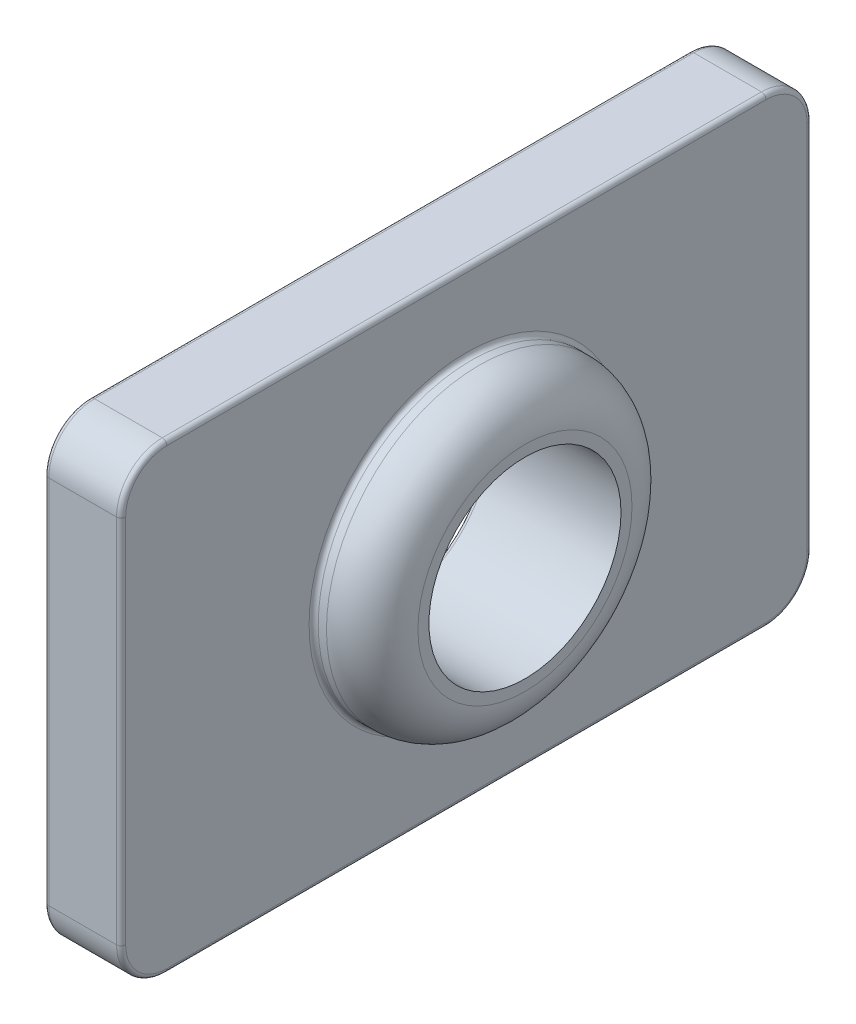
ISO-10303-21;
HEADER;
FILE_DESCRIPTION(('STEP AP214'),'2;1');
FILE_NAME('part.step','',(''),(''),'','','');
FILE_SCHEMA(('AUTOMOTIVE_DESIGN { 1 0 10303 214 1 1 1 1 }'));
ENDSEC;
DATA;
#1=APPLICATION_CONTEXT('core data for automotive mechanical design processes');
#2=APPLICATION_PROTOCOL_DEFINITION('international standard','automotive_design',2000,#1);
#3=PRODUCT_CONTEXT('',#1,'mechanical');
#4=PRODUCT('Part','Part','',(#3));
#5=PRODUCT_RELATED_PRODUCT_CATEGORY('part','',(#4));
#6=PRODUCT_DEFINITION_FORMATION('','',#4);
#7=PRODUCT_DEFINITION_CONTEXT('part definition',#1,'design');
#8=PRODUCT_DEFINITION('design','',#6,#7);
#9=PRODUCT_DEFINITION_SHAPE('','',#8);
#10=(LENGTH_UNIT() NAMED_UNIT(*) SI_UNIT(.MILLI.,.METRE.));
#11=(NAMED_UNIT(*) PLANE_ANGLE_UNIT() SI_UNIT($,.RADIAN.));
#12=(NAMED_UNIT(*) SI_UNIT($,.STERADIAN.) SOLID_ANGLE_UNIT());
#13=UNCERTAINTY_MEASURE_WITH_UNIT(LENGTH_MEASURE(1.E-05),#10,'distance_accuracy_value','');
#14=(GEOMETRIC_REPRESENTATION_CONTEXT(3) GLOBAL_UNCERTAINTY_ASSIGNED_CONTEXT((#13)) GLOBAL_UNIT_ASSIGNED_CONTEXT((#10,
#11,#12)) REPRESENTATION_CONTEXT('',''));
#15=CARTESIAN_POINT('',(0.,0.,0.));
#16=DIRECTION('',(0.,0.,1.));
#17=DIRECTION('',(1.,0.,0.));
#18=AXIS2_PLACEMENT_3D('',#15,#16,#17);
#19=CARTESIAN_POINT('',(1.68,-5.05,7.55));
#20=DIRECTION('',(0.,0.,-1.));
#21=DIRECTION('',(-1.,0.,0.));
#22=AXIS2_PLACEMENT_3D('',#19,#20,#21);
#23=PLANE('',#22);
#24=DIRECTION('',(-1.,0.,0.));
#25=VECTOR('',#24,1.);
#26=CARTESIAN_POINT('',(1.68,4.05,7.55));
#27=LINE('',#26,#25);
#28=CARTESIAN_POINT('',(1.58,4.05,7.55));
#29=VERTEX_POINT('',#28);
#30=CARTESIAN_POINT('',(0.1,4.05,7.55));
#31=VERTEX_POINT('',#30);
#32=EDGE_CURVE('E297',#29,#31,#27,.T.);
#33=ORIENTED_EDGE('',*,*,#32,.T.);
#34=DIRECTION('',(0.,-1.,0.));
#35=VECTOR('',#34,1.);
#36=CARTESIAN_POINT('',(0.1,-5.05,7.55));
#37=LINE('',#36,#35);
#38=CARTESIAN_POINT('',(0.1,-4.05,7.55));
#39=VERTEX_POINT('',#38);
#40=EDGE_CURVE('E203',#31,#39,#37,.T.);
#41=ORIENTED_EDGE('',*,*,#40,.T.);
#42=DIRECTION('',(-1.,0.,0.));
#43=VECTOR('',#42,1.);
#44=CARTESIAN_POINT('',(1.68,-4.05,7.55));
#45=LINE('',#44,#43);
#46=CARTESIAN_POINT('',(1.58,-4.05,7.55));
#47=VERTEX_POINT('',#46);
#48=EDGE_CURVE('E306',#39,#47,#45,.F.);
#49=ORIENTED_EDGE('',*,*,#48,.T.);
#50=DIRECTION('',(0.,-1.,0.));
#51=VECTOR('',#50,1.);
#52=CARTESIAN_POINT('',(1.58,4.05,7.55));
#53=LINE('',#52,#51);
#54=EDGE_CURVE('E201',#47,#29,#53,.F.);
#55=ORIENTED_EDGE('',*,*,#54,.T.);
#56=EDGE_LOOP('',(#33,#41,#49,#55));
#57=FACE_BOUND('',#56,.T.);
#58=ADVANCED_FACE('F34',(#57),#23,.F.);
#59=CARTESIAN_POINT('',(1.68,-5.05,-7.55));
#60=DIRECTION('',(0.,1.,0.));
#61=DIRECTION('',(0.,0.,1.));
#62=AXIS2_PLACEMENT_3D('',#59,#60,#61);
#63=PLANE('',#62);
#64=DIRECTION('',(-1.,0.,0.));
#65=VECTOR('',#64,1.);
#66=CARTESIAN_POINT('',(1.68,-5.05,6.55));
#67=LINE('',#66,#65);
#68=CARTESIAN_POINT('',(1.58,-5.05,6.55));
#69=VERTEX_POINT('',#68);
#70=CARTESIAN_POINT('',(0.1,-5.05,6.55));
#71=VERTEX_POINT('',#70);
#72=EDGE_CURVE('E294',#69,#71,#67,.T.);
#73=ORIENTED_EDGE('',*,*,#72,.T.);
#74=DIRECTION('',(0.,0.,-1.));
#75=VECTOR('',#74,1.);
#76=CARTESIAN_POINT('',(0.1,-5.05,-7.55));
#77=LINE('',#76,#75);
#78=CARTESIAN_POINT('',(0.1,-5.05,-6.55));
#79=VERTEX_POINT('',#78);
#80=EDGE_CURVE('E211',#71,#79,#77,.T.);
#81=ORIENTED_EDGE('',*,*,#80,.T.);
#82=DIRECTION('',(-1.,0.,0.));
#83=VECTOR('',#82,1.);
#84=CARTESIAN_POINT('',(1.68,-5.05,-6.55));
#85=LINE('',#84,#83);
#86=CARTESIAN_POINT('',(1.58,-5.05,-6.55));
#87=VERTEX_POINT('',#86);
#88=EDGE_CURVE('E287',#79,#87,#85,.F.);
#89=ORIENTED_EDGE('',*,*,#88,.T.);
#90=DIRECTION('',(0.,0.,-1.));
#91=VECTOR('',#90,1.);
#92=CARTESIAN_POINT('',(1.58,-5.05,6.55));
#93=LINE('',#92,#91);
#94=EDGE_CURVE('E209',#87,#69,#93,.F.);
#95=ORIENTED_EDGE('',*,*,#94,.T.);
#96=EDGE_LOOP('',(#73,#81,#89,#95));
#97=FACE_BOUND('',#96,.T.);
#98=ADVANCED_FACE('F292',(#97),#63,.F.);
#99=CARTESIAN_POINT('',(1.68,-5.05,-7.55));
#100=DIRECTION('',(0.,0.,1.));
#101=DIRECTION('',(1.,0.,0.));
#102=AXIS2_PLACEMENT_3D('',#99,#100,#101);
#103=PLANE('',#102);
#104=DIRECTION('',(-1.,0.,0.));
#105=VECTOR('',#104,1.);
#106=CARTESIAN_POINT('',(1.68,-4.05,-7.55));
#107=LINE('',#106,#105);
#108=CARTESIAN_POINT('',(1.58,-4.05,-7.55));
#109=VERTEX_POINT('',#108);
#110=CARTESIAN_POINT('',(0.1,-4.05,-7.55));
#111=VERTEX_POINT('',#110);
#112=EDGE_CURVE('E289',#109,#111,#107,.T.);
#113=ORIENTED_EDGE('',*,*,#112,.T.);
#114=DIRECTION('',(0.,1.,0.));
#115=VECTOR('',#114,1.);
#116=CARTESIAN_POINT('',(0.1,-5.05,-7.55));
#117=LINE('',#116,#115);
#118=CARTESIAN_POINT('',(0.1,4.05,-7.55));
#119=VERTEX_POINT('',#118);
#120=EDGE_CURVE('E186',#111,#119,#117,.T.);
#121=ORIENTED_EDGE('',*,*,#120,.T.);
#122=DIRECTION('',(-1.,0.,0.));
#123=VECTOR('',#122,1.);
#124=CARTESIAN_POINT('',(1.68,4.05,-7.55));
#125=LINE('',#124,#123);
#126=CARTESIAN_POINT('',(1.58,4.05,-7.55));
#127=VERTEX_POINT('',#126);
#128=EDGE_CURVE('E309',#119,#127,#125,.F.);
#129=ORIENTED_EDGE('',*,*,#128,.T.);
#130=DIRECTION('',(0.,1.,0.));
#131=VECTOR('',#130,1.);
#132=CARTESIAN_POINT('',(1.58,-4.05,-7.55));
#133=LINE('',#132,#131);
#134=EDGE_CURVE('E184',#127,#109,#133,.F.);
#135=ORIENTED_EDGE('',*,*,#134,.T.);
#136=EDGE_LOOP('',(#113,#121,#129,#135));
#137=FACE_BOUND('',#136,.T.);
#138=ADVANCED_FACE('F339',(#137),#103,.F.);
#139=CARTESIAN_POINT('',(1.68,5.05,-7.55));
#140=DIRECTION('',(0.,-1.,0.));
#141=DIRECTION('',(0.,0.,-1.));
#142=AXIS2_PLACEMENT_3D('',#139,#140,#141);
#143=PLANE('',#142);
#144=DIRECTION('',(-1.,0.,0.));
#145=VECTOR('',#144,1.);
#146=CARTESIAN_POINT('',(1.68,5.05,-6.55));
#147=LINE('',#146,#145);
#148=CARTESIAN_POINT('',(1.58,5.05,-6.55));
#149=VERTEX_POINT('',#148);
#150=CARTESIAN_POINT('',(0.1,5.05,-6.55));
#151=VERTEX_POINT('',#150);
#152=EDGE_CURVE('E316',#149,#151,#147,.T.);
#153=ORIENTED_EDGE('',*,*,#152,.T.);
#154=DIRECTION('',(0.,0.,1.));
#155=VECTOR('',#154,1.);
#156=CARTESIAN_POINT('',(0.1,5.05,-7.55));
#157=LINE('',#156,#155);
#158=CARTESIAN_POINT('',(0.1,5.05,6.55));
#159=VERTEX_POINT('',#158);
#160=EDGE_CURVE('E194',#151,#159,#157,.T.);
#161=ORIENTED_EDGE('',*,*,#160,.T.);
#162=DIRECTION('',(-1.,0.,0.));
#163=VECTOR('',#162,1.);
#164=CARTESIAN_POINT('',(1.68,5.05,6.55));
#165=LINE('',#164,#163);
#166=CARTESIAN_POINT('',(1.58,5.05,6.55));
#167=VERTEX_POINT('',#166);
#168=EDGE_CURVE('E313',#159,#167,#165,.F.);
#169=ORIENTED_EDGE('',*,*,#168,.T.);
#170=DIRECTION('',(0.,0.,1.));
#171=VECTOR('',#170,1.);
#172=CARTESIAN_POINT('',(1.58,5.05,-6.55));
#173=LINE('',#172,#171);
#174=EDGE_CURVE('E192',#167,#149,#173,.F.);
#175=ORIENTED_EDGE('',*,*,#174,.T.);
#176=EDGE_LOOP('',(#153,#161,#169,#175));
#177=FACE_BOUND('',#176,.T.);
#178=ADVANCED_FACE('F383',(#177),#143,.F.);
#179=CARTESIAN_POINT('',(1.68,0.,0.));
#180=DIRECTION('',(1.,0.,0.));
#181=DIRECTION('',(0.,0.,-1.));
#182=AXIS2_PLACEMENT_3D('',#179,#180,#181);
#183=PLANE('',#182);
#184=DIRECTION('',(0.,0.,1.));
#185=VECTOR('',#184,1.);
#186=CARTESIAN_POINT('',(1.68,4.95,6.55));
#187=LINE('',#186,#185);
#188=CARTESIAN_POINT('',(1.68,4.95,-6.55));
#189=VERTEX_POINT('',#188);
#190=CARTESIAN_POINT('',(1.68,4.95,6.55));
#191=VERTEX_POINT('',#190);
#192=EDGE_CURVE('E51',#189,#191,#187,.T.);
#193=ORIENTED_EDGE('',*,*,#192,.T.);
#194=CARTESIAN_POINT('',(1.68,4.05,6.55));
#195=DIRECTION('',(1.,0.,0.));
#196=DIRECTION('',(0.,0.,-1.));
#197=AXIS2_PLACEMENT_3D('',#194,#195,#196);
#198=CIRCLE('',#197,0.9);
#199=CARTESIAN_POINT('',(1.68,4.05,7.45));
#200=VERTEX_POINT('',#199);
#201=EDGE_CURVE('E43',#191,#200,#198,.T.);
#202=ORIENTED_EDGE('',*,*,#201,.T.);
#203=DIRECTION('',(0.,-1.,0.));
#204=VECTOR('',#203,1.);
#205=CARTESIAN_POINT('',(1.68,-4.05,7.45));
#206=LINE('',#205,#204);
#207=CARTESIAN_POINT('',(1.68,-4.05,7.45));
#208=VERTEX_POINT('',#207);
#209=EDGE_CURVE('E219',#200,#208,#206,.T.);
#210=ORIENTED_EDGE('',*,*,#209,.T.);
#211=CARTESIAN_POINT('',(1.68,-4.05,6.55));
#212=DIRECTION('',(1.,0.,0.));
#213=DIRECTION('',(0.,0.,-1.));
#214=AXIS2_PLACEMENT_3D('',#211,#212,#213);
#215=CIRCLE('',#214,0.9);
#216=CARTESIAN_POINT('',(1.68,-4.95,6.55));
#217=VERTEX_POINT('',#216);
#218=EDGE_CURVE('E221',#208,#217,#215,.T.);
#219=ORIENTED_EDGE('',*,*,#218,.T.);
#220=DIRECTION('',(0.,0.,-1.));
#221=VECTOR('',#220,1.);
#222=CARTESIAN_POINT('',(1.68,-4.95,-6.55));
#223=LINE('',#222,#221);
#224=CARTESIAN_POINT('',(1.68,-4.95,-6.55));
#225=VERTEX_POINT('',#224);
#226=EDGE_CURVE('E223',#217,#225,#223,.T.);
#227=ORIENTED_EDGE('',*,*,#226,.T.);
#228=CARTESIAN_POINT('',(1.68,-4.05,-6.55));
#229=DIRECTION('',(1.,0.,0.));
#230=DIRECTION('',(0.,0.,-1.));
#231=AXIS2_PLACEMENT_3D('',#228,#229,#230);
#232=CIRCLE('',#231,0.9);
#233=CARTESIAN_POINT('',(1.68,-4.05,-7.45));
#234=VERTEX_POINT('',#233);
#235=EDGE_CURVE('E225',#225,#234,#232,.T.);
#236=ORIENTED_EDGE('',*,*,#235,.T.);
#237=DIRECTION('',(0.,1.,0.));
#238=VECTOR('',#237,1.);
#239=CARTESIAN_POINT('',(1.68,4.05,-7.45));
#240=LINE('',#239,#238);
#241=CARTESIAN_POINT('',(1.68,4.05,-7.45));
#242=VERTEX_POINT('',#241);
#243=EDGE_CURVE('E227',#234,#242,#240,.T.);
#244=ORIENTED_EDGE('',*,*,#243,.T.);
#245=CARTESIAN_POINT('',(1.68,4.05,-6.55));
#246=DIRECTION('',(1.,0.,0.));
#247=DIRECTION('',(0.,0.,-1.));
#248=AXIS2_PLACEMENT_3D('',#245,#246,#247);
#249=CIRCLE('',#248,0.9);
#250=EDGE_CURVE('E56',#242,#189,#249,.T.);
#251=ORIENTED_EDGE('',*,*,#250,.T.);
#252=EDGE_LOOP('',(#193,#202,#210,#219,#227,#236,#244,#251));
#253=FACE_BOUND('',#252,.T.);
#254=CARTESIAN_POINT('',(1.68,0.,0.));
#255=DIRECTION('',(1.,0.,0.));
#256=DIRECTION('',(0.,0.,-1.));
#257=AXIS2_PLACEMENT_3D('',#254,#255,#256);
#258=CIRCLE('',#257,3.44);
#259=CARTESIAN_POINT('',(1.68,0.,-3.44));
#260=VERTEX_POINT('',#259);
#261=EDGE_CURVE('E216',#260,#260,#258,.F.);
#262=ORIENTED_EDGE('',*,*,#261,.T.);
#263=EDGE_LOOP('',(#262));
#264=FACE_BOUND('',#263,.T.);
#265=ADVANCED_FACE('F355',(#253,#264),#183,.T.);
#266=CARTESIAN_POINT('',(0.,0.,0.));
#267=DIRECTION('',(1.,0.,0.));
#268=DIRECTION('',(0.,0.,-1.));
#269=AXIS2_PLACEMENT_3D('',#266,#267,#268);
#270=PLANE('',#269);
#271=DIRECTION('',(0.,1.,0.));
#272=VECTOR('',#271,1.);
#273=CARTESIAN_POINT('',(0.,0.,-7.45));
#274=LINE('',#273,#272);
#275=CARTESIAN_POINT('',(0.,4.05,-7.45));
#276=VERTEX_POINT('',#275);
#277=CARTESIAN_POINT('',(0.,-4.05,-7.45));
#278=VERTEX_POINT('',#277);
#279=EDGE_CURVE('E174',#276,#278,#274,.F.);
#280=ORIENTED_EDGE('',*,*,#279,.T.);
#281=CARTESIAN_POINT('',(0.,-4.05,-6.55));
#282=DIRECTION('',(1.,0.,0.));
#283=DIRECTION('',(0.,0.,-1.));
#284=AXIS2_PLACEMENT_3D('',#281,#282,#283);
#285=CIRCLE('',#284,0.9);
#286=CARTESIAN_POINT('',(0.,-4.95,-6.55));
#287=VERTEX_POINT('',#286);
#288=EDGE_CURVE('E154',#278,#287,#285,.F.);
#289=ORIENTED_EDGE('',*,*,#288,.T.);
#290=DIRECTION('',(0.,0.,-1.));
#291=VECTOR('',#290,1.);
#292=CARTESIAN_POINT('',(0.,-4.95,0.));
#293=LINE('',#292,#291);
#294=CARTESIAN_POINT('',(0.,-4.95,6.55));
#295=VERTEX_POINT('',#294);
#296=EDGE_CURVE('E162',#287,#295,#293,.F.);
#297=ORIENTED_EDGE('',*,*,#296,.T.);
#298=CARTESIAN_POINT('',(0.,-4.05,6.55));
#299=DIRECTION('',(1.,0.,0.));
#300=DIRECTION('',(0.,0.,-1.));
#301=AXIS2_PLACEMENT_3D('',#298,#299,#300);
#302=CIRCLE('',#301,0.9);
#303=CARTESIAN_POINT('',(0.,-4.05,7.45));
#304=VERTEX_POINT('',#303);
#305=EDGE_CURVE('E168',#295,#304,#302,.F.);
#306=ORIENTED_EDGE('',*,*,#305,.T.);
#307=DIRECTION('',(0.,-1.,0.));
#308=VECTOR('',#307,1.);
#309=CARTESIAN_POINT('',(0.,0.,7.45));
#310=LINE('',#309,#308);
#311=CARTESIAN_POINT('',(0.,4.05,7.45));
#312=VERTEX_POINT('',#311);
#313=EDGE_CURVE('E322',#304,#312,#310,.F.);
#314=ORIENTED_EDGE('',*,*,#313,.T.);
#315=CARTESIAN_POINT('',(0.,4.05,6.55));
#316=DIRECTION('',(1.,0.,0.));
#317=DIRECTION('',(0.,0.,-1.));
#318=AXIS2_PLACEMENT_3D('',#315,#316,#317);
#319=CIRCLE('',#318,0.9);
#320=CARTESIAN_POINT('',(0.,4.95,6.55));
#321=VERTEX_POINT('',#320);
#322=EDGE_CURVE('E324',#312,#321,#319,.F.);
#323=ORIENTED_EDGE('',*,*,#322,.T.);
#324=DIRECTION('',(0.,0.,1.));
#325=VECTOR('',#324,1.);
#326=CARTESIAN_POINT('',(0.,4.95,0.));
#327=LINE('',#326,#325);
#328=CARTESIAN_POINT('',(0.,4.95,-6.55));
#329=VERTEX_POINT('',#328);
#330=EDGE_CURVE('E326',#321,#329,#327,.F.);
#331=ORIENTED_EDGE('',*,*,#330,.T.);
#332=CARTESIAN_POINT('',(0.,4.05,-6.55));
#333=DIRECTION('',(1.,0.,0.));
#334=DIRECTION('',(0.,0.,-1.));
#335=AXIS2_PLACEMENT_3D('',#332,#333,#334);
#336=CIRCLE('',#335,0.9);
#337=EDGE_CURVE('E179',#329,#276,#336,.F.);
#338=ORIENTED_EDGE('',*,*,#337,.T.);
#339=EDGE_LOOP('',(#280,#289,#297,#306,#314,#323,#331,#338));
#340=FACE_BOUND('',#339,.T.);
#341=CARTESIAN_POINT('',(0.,0.,0.));
#342=DIRECTION('',(1.,0.,0.));
#343=DIRECTION('',(0.,0.,-1.));
#344=AXIS2_PLACEMENT_3D('',#341,#342,#343);
#345=CIRCLE('',#344,2.2);
#346=CARTESIAN_POINT('',(0.,0.,-2.2));
#347=VERTEX_POINT('',#346);
#348=EDGE_CURVE('E169',#347,#347,#345,.T.);
#349=ORIENTED_EDGE('',*,*,#348,.T.);
#350=EDGE_LOOP('',(#349));
#351=FACE_BOUND('',#350,.T.);
#352=ADVANCED_FACE('F171',(#340,#351),#270,.F.);
#353=CARTESIAN_POINT('',(2.96,0.,0.));
#354=DIRECTION('',(-1.,0.,0.));
#355=DIRECTION('',(0.,0.,1.));
#356=AXIS2_PLACEMENT_3D('',#353,#354,#355);
#357=CYLINDRICAL_SURFACE('',#356,3.34);
#358=CARTESIAN_POINT('',(1.78,0.,0.));
#359=DIRECTION('',(1.,0.,0.));
#360=DIRECTION('',(0.,0.,-1.));
#361=AXIS2_PLACEMENT_3D('',#358,#359,#360);
#362=CIRCLE('',#361,3.34);
#363=CARTESIAN_POINT('',(1.78,0.,3.34));
#364=VERTEX_POINT('',#363);
#365=EDGE_CURVE('E11',#364,#364,#362,.T.);
#366=CARTESIAN_POINT('',(1.96,0.,0.));
#367=DIRECTION('',(1.,0.,0.));
#368=DIRECTION('',(0.,0.,-1.));
#369=AXIS2_PLACEMENT_3D('',#366,#367,#368);
#370=CIRCLE('',#369,3.34);
#371=CARTESIAN_POINT('',(1.96,0.,3.34));
#372=VERTEX_POINT('',#371);
#373=EDGE_CURVE('E295',#372,#372,#370,.F.);
#374=CARTESIAN_POINT('',(1.78,0.,3.34));
#375=CARTESIAN_POINT('',(1.781875,0.,3.34));
#376=CARTESIAN_POINT('',(1.78375,0.,3.34));
#377=CARTESIAN_POINT('',(1.7875,0.,3.34));
#378=CARTESIAN_POINT('',(1.789375,0.,3.34));
#379=CARTESIAN_POINT('',(1.793125,0.,3.34));
#380=CARTESIAN_POINT('',(1.795,0.,3.34));
#381=CARTESIAN_POINT('',(1.79875,0.,3.34));
#382=CARTESIAN_POINT('',(1.800625,0.,3.34));
#383=CARTESIAN_POINT('',(1.804375,0.,3.34));
#384=CARTESIAN_POINT('',(1.80625,0.,3.34));
#385=CARTESIAN_POINT('',(1.81,0.,3.34));
#386=CARTESIAN_POINT('',(1.811875,0.,3.34));
#387=CARTESIAN_POINT('',(1.815625,0.,3.34));
#388=CARTESIAN_POINT('',(1.8175,0.,3.34));
#389=CARTESIAN_POINT('',(1.82125,0.,3.34));
#390=CARTESIAN_POINT('',(1.823125,0.,3.34));
#391=CARTESIAN_POINT('',(1.826875,0.,3.34));
#392=CARTESIAN_POINT('',(1.82875,0.,3.34));
#393=CARTESIAN_POINT('',(1.8325,0.,3.34));
#394=CARTESIAN_POINT('',(1.834375,0.,3.34));
#395=CARTESIAN_POINT('',(1.838125,0.,3.34));
#396=CARTESIAN_POINT('',(1.84,0.,3.34));
#397=CARTESIAN_POINT('',(1.84375,0.,3.34));
#398=CARTESIAN_POINT('',(1.845625,0.,3.34));
#399=CARTESIAN_POINT('',(1.849375,0.,3.34));
#400=CARTESIAN_POINT('',(1.85125,0.,3.34));
#401=CARTESIAN_POINT('',(1.855,0.,3.34));
#402=CARTESIAN_POINT('',(1.856875,0.,3.34));
#403=CARTESIAN_POINT('',(1.860625,0.,3.34));
#404=CARTESIAN_POINT('',(1.8625,0.,3.34));
#405=CARTESIAN_POINT('',(1.86625,0.,3.34));
#406=CARTESIAN_POINT('',(1.868125,0.,3.34));
#407=CARTESIAN_POINT('',(1.871875,0.,3.34));
#408=CARTESIAN_POINT('',(1.87375,0.,3.34));
#409=CARTESIAN_POINT('',(1.8775,0.,3.34));
#410=CARTESIAN_POINT('',(1.879375,0.,3.34));
#411=CARTESIAN_POINT('',(1.883125,0.,3.34));
#412=CARTESIAN_POINT('',(1.885,0.,3.34));
#413=CARTESIAN_POINT('',(1.88875,0.,3.34));
#414=CARTESIAN_POINT('',(1.890625,0.,3.34));
#415=CARTESIAN_POINT('',(1.894375,0.,3.34));
#416=CARTESIAN_POINT('',(1.89625,0.,3.34));
#417=CARTESIAN_POINT('',(1.9,0.,3.34));
#418=CARTESIAN_POINT('',(1.901875,0.,3.34));
#419=CARTESIAN_POINT('',(1.905625,0.,3.34));
#420=CARTESIAN_POINT('',(1.9075,0.,3.34));
#421=CARTESIAN_POINT('',(1.91125,0.,3.34));
#422=CARTESIAN_POINT('',(1.913125,0.,3.34));
#423=CARTESIAN_POINT('',(1.916875,0.,3.34));
#424=CARTESIAN_POINT('',(1.91875,0.,3.34));
#425=CARTESIAN_POINT('',(1.9225,0.,3.34));
#426=CARTESIAN_POINT('',(1.924375,0.,3.34));
#427=CARTESIAN_POINT('',(1.928125,0.,3.34));
#428=CARTESIAN_POINT('',(1.93,0.,3.34));
#429=CARTESIAN_POINT('',(1.93375,0.,3.34));
#430=CARTESIAN_POINT('',(1.935625,0.,3.34));
#431=CARTESIAN_POINT('',(1.939375,0.,3.34));
#432=CARTESIAN_POINT('',(1.94125,0.,3.34));
#433=CARTESIAN_POINT('',(1.945,0.,3.34));
#434=CARTESIAN_POINT('',(1.946875,0.,3.34));
#435=CARTESIAN_POINT('',(1.950625,0.,3.34));
#436=CARTESIAN_POINT('',(1.9525,0.,3.34));
#437=CARTESIAN_POINT('',(1.95625,0.,3.34));
#438=CARTESIAN_POINT('',(1.958125,0.,3.34));
#439=CARTESIAN_POINT('',(1.96,0.,3.34));
#440=B_SPLINE_CURVE_WITH_KNOTS('',3,(#374,#375,#376,#377,#378,#379,#380,#381,#382,#383,#384,
#385,#386,#387,#388,#389,#390,#391,#392,#393,#394,#395,#396,#397,#398,#399,#400,#401,#402,#403,
#404,#405,#406,#407,#408,#409,#410,#411,#412,#413,#414,#415,#416,#417,#418,#419,#420,#421,#422,
#423,#424,#425,#426,#427,#428,#429,#430,#431,#432,#433,#434,#435,#436,#437,#438,#439),
.UNSPECIFIED.,.F.,.F.,(4,2,2,2,2,2,2,2,2,2,2,2,2,2,2,2,2,2,2,2,2,2,2,2,2,2,2,2,2,2,2,2,4),(0.,
0.00562499999999999,0.01125,0.016875,0.0225,0.0281249999999999,0.0337499999999999,
0.0393749999999999,0.0449999999999999,0.0506250000000001,0.0562500000000001,0.0618750000000001,
0.0675000000000001,0.0731250000000001,0.07875,0.084375,0.09,0.095625,0.10125,0.106875,0.1125,
0.118125,0.12375,0.129375,0.135,0.140625,0.14625,0.151875,0.1575,0.163125,0.16875,0.174375,
0.18),.UNSPECIFIED.);
#441=EDGE_CURVE('BSEAM598',#364,#372,#440,.T.);
#442=ORIENTED_EDGE('',*,*,#365,.T.);
#443=ORIENTED_EDGE('',*,*,#373,.T.);
#444=ORIENTED_EDGE('',*,*,#441,.T.);
#445=ORIENTED_EDGE('',*,*,#441,.F.);
#446=EDGE_LOOP('',(#442,#444,#443,#445));
#447=FACE_BOUND('',#446,.T.);
#448=ADVANCED_FACE('F598',(#447),#357,.T.);
#449=CARTESIAN_POINT('',(2.96,0.,0.));
#450=DIRECTION('',(1.,0.,0.));
#451=DIRECTION('',(0.,0.,-1.));
#452=AXIS2_PLACEMENT_3D('',#449,#450,#451);
#453=PLANE('',#452);
#454=CARTESIAN_POINT('',(2.96,0.,0.));
#455=DIRECTION('',(1.,0.,0.));
#456=DIRECTION('',(0.,0.,-1.));
#457=AXIS2_PLACEMENT_3D('',#454,#455,#456);
#458=CIRCLE('',#457,2.1);
#459=CARTESIAN_POINT('',(2.96,0.,-2.1));
#460=VERTEX_POINT('',#459);
#461=EDGE_CURVE('E249',#460,#460,#458,.T.);
#462=ORIENTED_EDGE('',*,*,#461,.F.);
#463=EDGE_LOOP('',(#462));
#464=FACE_BOUND('',#463,.T.);
#465=CARTESIAN_POINT('',(2.96,0.,0.));
#466=DIRECTION('',(1.,0.,0.));
#467=DIRECTION('',(0.,0.,-1.));
#468=AXIS2_PLACEMENT_3D('',#465,#466,#467);
#469=CIRCLE('',#468,2.34);
#470=CARTESIAN_POINT('',(2.96,0.,-2.34));
#471=VERTEX_POINT('',#470);
#472=EDGE_CURVE('E300',#471,#471,#469,.T.);
#473=ORIENTED_EDGE('',*,*,#472,.T.);
#474=EDGE_LOOP('',(#473));
#475=FACE_BOUND('',#474,.T.);
#476=ADVANCED_FACE('F404',(#464,#475),#453,.T.);
#477=CARTESIAN_POINT('',(1.96,0.,0.));
#478=DIRECTION('',(1.,0.,0.));
#479=DIRECTION('',(0.,0.,-1.));
#480=AXIS2_PLACEMENT_3D('',#477,#478,#479);
#481=TOROIDAL_SURFACE('',#480,2.34,1.);
#482=ORIENTED_EDGE('',*,*,#373,.F.);
#483=EDGE_LOOP('',(#482));
#484=FACE_BOUND('',#483,.T.);
#485=ORIENTED_EDGE('',*,*,#472,.F.);
#486=EDGE_LOOP('',(#485));
#487=FACE_BOUND('',#486,.T.);
#488=ADVANCED_FACE('F400',(#484,#487),#481,.T.);
#489=CARTESIAN_POINT('',(2.96,0.,0.));
#490=DIRECTION('',(1.,0.,0.));
#491=DIRECTION('',(0.,0.,-1.));
#492=AXIS2_PLACEMENT_3D('',#489,#490,#491);
#493=CYLINDRICAL_SURFACE('',#492,2.1);
#494=CARTESIAN_POINT('',(0.0999999999999998,0.,0.));
#495=DIRECTION('',(1.,0.,0.));
#496=DIRECTION('',(0.,0.,-1.));
#497=AXIS2_PLACEMENT_3D('',#494,#495,#496);
#498=CIRCLE('',#497,2.1);
#499=CARTESIAN_POINT('',(0.0999999999999998,0.,-2.1));
#500=VERTEX_POINT('',#499);
#501=EDGE_CURVE('E213',#500,#500,#498,.F.);
#502=ORIENTED_EDGE('',*,*,#501,.T.);
#503=EDGE_LOOP('',(#502));
#504=FACE_BOUND('',#503,.T.);
#505=ORIENTED_EDGE('',*,*,#461,.T.);
#506=EDGE_LOOP('',(#505));
#507=FACE_BOUND('',#506,.T.);
#508=ADVANCED_FACE('F403',(#504,#507),#493,.F.);
#509=CARTESIAN_POINT('',(1.68,-4.05,6.55));
#510=DIRECTION('',(-1.,0.,0.));
#511=DIRECTION('',(0.,0.,1.));
#512=AXIS2_PLACEMENT_3D('',#509,#510,#511);
#513=CYLINDRICAL_SURFACE('',#512,1.);
#514=ORIENTED_EDGE('',*,*,#48,.F.);
#515=CARTESIAN_POINT('',(0.1,-4.05,6.55));
#516=DIRECTION('',(1.,0.,0.));
#517=DIRECTION('',(0.,0.,-1.));
#518=AXIS2_PLACEMENT_3D('',#515,#516,#517);
#519=CIRCLE('',#518,1.);
#520=EDGE_CURVE('E207',#39,#71,#519,.T.);
#521=ORIENTED_EDGE('',*,*,#520,.T.);
#522=ORIENTED_EDGE('',*,*,#72,.F.);
#523=CARTESIAN_POINT('',(1.58,-4.05,6.55));
#524=DIRECTION('',(1.,0.,0.));
#525=DIRECTION('',(0.,0.,-1.));
#526=AXIS2_PLACEMENT_3D('',#523,#524,#525);
#527=CIRCLE('',#526,1.);
#528=EDGE_CURVE('E205',#69,#47,#527,.F.);
#529=ORIENTED_EDGE('',*,*,#528,.T.);
#530=EDGE_LOOP('',(#514,#521,#522,#529));
#531=FACE_BOUND('',#530,.T.);
#532=ADVANCED_FACE('F406',(#531),#513,.T.);
#533=CARTESIAN_POINT('',(1.68,-4.05,-6.55));
#534=DIRECTION('',(-1.,0.,0.));
#535=DIRECTION('',(0.,0.,1.));
#536=AXIS2_PLACEMENT_3D('',#533,#534,#535);
#537=CYLINDRICAL_SURFACE('',#536,1.);
#538=ORIENTED_EDGE('',*,*,#88,.F.);
#539=CARTESIAN_POINT('',(0.1,-4.05,-6.55));
#540=DIRECTION('',(1.,0.,0.));
#541=DIRECTION('',(0.,0.,-1.));
#542=AXIS2_PLACEMENT_3D('',#539,#540,#541);
#543=CIRCLE('',#542,1.);
#544=EDGE_CURVE('E156',#79,#111,#543,.T.);
#545=ORIENTED_EDGE('',*,*,#544,.T.);
#546=ORIENTED_EDGE('',*,*,#112,.F.);
#547=CARTESIAN_POINT('',(1.58,-4.05,-6.55));
#548=DIRECTION('',(1.,0.,0.));
#549=DIRECTION('',(0.,0.,-1.));
#550=AXIS2_PLACEMENT_3D('',#547,#548,#549);
#551=CIRCLE('',#550,1.);
#552=EDGE_CURVE('E176',#109,#87,#551,.F.);
#553=ORIENTED_EDGE('',*,*,#552,.T.);
#554=EDGE_LOOP('',(#538,#545,#546,#553));
#555=FACE_BOUND('',#554,.T.);
#556=ADVANCED_FACE('F286',(#555),#537,.T.);
#557=CARTESIAN_POINT('',(1.68,4.05,-6.55));
#558=DIRECTION('',(-1.,0.,0.));
#559=DIRECTION('',(0.,0.,1.));
#560=AXIS2_PLACEMENT_3D('',#557,#558,#559);
#561=CYLINDRICAL_SURFACE('',#560,1.);
#562=ORIENTED_EDGE('',*,*,#128,.F.);
#563=CARTESIAN_POINT('',(0.1,4.05,-6.55));
#564=DIRECTION('',(1.,0.,0.));
#565=DIRECTION('',(0.,0.,-1.));
#566=AXIS2_PLACEMENT_3D('',#563,#564,#565);
#567=CIRCLE('',#566,1.);
#568=EDGE_CURVE('E190',#119,#151,#567,.T.);
#569=ORIENTED_EDGE('',*,*,#568,.T.);
#570=ORIENTED_EDGE('',*,*,#152,.F.);
#571=CARTESIAN_POINT('',(1.58,4.05,-6.55));
#572=DIRECTION('',(1.,0.,0.));
#573=DIRECTION('',(0.,0.,-1.));
#574=AXIS2_PLACEMENT_3D('',#571,#572,#573);
#575=CIRCLE('',#574,1.);
#576=EDGE_CURVE('E188',#149,#127,#575,.F.);
#577=ORIENTED_EDGE('',*,*,#576,.T.);
#578=EDGE_LOOP('',(#562,#569,#570,#577));
#579=FACE_BOUND('',#578,.T.);
#580=ADVANCED_FACE('F341',(#579),#561,.T.);
#581=CARTESIAN_POINT('',(1.68,4.05,6.55));
#582=DIRECTION('',(-1.,0.,0.));
#583=DIRECTION('',(0.,0.,1.));
#584=AXIS2_PLACEMENT_3D('',#581,#582,#583);
#585=CYLINDRICAL_SURFACE('',#584,1.);
#586=ORIENTED_EDGE('',*,*,#168,.F.);
#587=CARTESIAN_POINT('',(0.1,4.05,6.55));
#588=DIRECTION('',(1.,0.,0.));
#589=DIRECTION('',(0.,0.,-1.));
#590=AXIS2_PLACEMENT_3D('',#587,#588,#589);
#591=CIRCLE('',#590,1.);
#592=EDGE_CURVE('E199',#159,#31,#591,.T.);
#593=ORIENTED_EDGE('',*,*,#592,.T.);
#594=ORIENTED_EDGE('',*,*,#32,.F.);
#595=CARTESIAN_POINT('',(1.58,4.05,6.55));
#596=DIRECTION('',(1.,0.,0.));
#597=DIRECTION('',(0.,0.,-1.));
#598=AXIS2_PLACEMENT_3D('',#595,#596,#597);
#599=CIRCLE('',#598,1.);
#600=EDGE_CURVE('E196',#29,#167,#599,.F.);
#601=ORIENTED_EDGE('',*,*,#600,.T.);
#602=EDGE_LOOP('',(#586,#593,#594,#601));
#603=FACE_BOUND('',#602,.T.);
#604=ADVANCED_FACE('F372',(#603),#585,.T.);
#605=CARTESIAN_POINT('',(0.1,4.05,6.55));
#606=DIRECTION('',(1.,0.,0.));
#607=DIRECTION('',(0.,0.,-1.));
#608=AXIS2_PLACEMENT_3D('',#605,#606,#607);
#609=TOROIDAL_SURFACE('',#608,0.9,0.1);
#610=CARTESIAN_POINT('',(0.1,4.05,7.45));
#611=DIRECTION('',(0.,-1.,0.));
#612=DIRECTION('',(0.,0.,-1.));
#613=AXIS2_PLACEMENT_3D('',#610,#611,#612);
#614=CIRCLE('',#613,0.1);
#615=EDGE_CURVE('E243',#31,#312,#614,.T.);
#616=ORIENTED_EDGE('',*,*,#615,.F.);
#617=ORIENTED_EDGE('',*,*,#592,.F.);
#618=CARTESIAN_POINT('',(0.1,4.95,6.55));
#619=DIRECTION('',(0.,0.,-1.));
#620=DIRECTION('',(-1.,0.,0.));
#621=AXIS2_PLACEMENT_3D('',#618,#619,#620);
#622=CIRCLE('',#621,0.1);
#623=EDGE_CURVE('E246',#321,#159,#622,.T.);
#624=ORIENTED_EDGE('',*,*,#623,.F.);
#625=ORIENTED_EDGE('',*,*,#322,.F.);
#626=EDGE_LOOP('',(#616,#617,#624,#625));
#627=FACE_BOUND('',#626,.T.);
#628=ADVANCED_FACE('F376',(#627),#609,.T.);
#629=CARTESIAN_POINT('',(0.1,4.95,-7.55));
#630=DIRECTION('',(0.,0.,1.));
#631=DIRECTION('',(0.,-1.,0.));
#632=AXIS2_PLACEMENT_3D('',#629,#630,#631);
#633=CYLINDRICAL_SURFACE('',#632,0.1);
#634=ORIENTED_EDGE('',*,*,#623,.T.);
#635=ORIENTED_EDGE('',*,*,#160,.F.);
#636=CARTESIAN_POINT('',(0.1,4.95,-6.55));
#637=DIRECTION('',(0.,0.,-1.));
#638=DIRECTION('',(-1.,0.,0.));
#639=AXIS2_PLACEMENT_3D('',#636,#637,#638);
#640=CIRCLE('',#639,0.1);
#641=EDGE_CURVE('E240',#329,#151,#640,.T.);
#642=ORIENTED_EDGE('',*,*,#641,.F.);
#643=ORIENTED_EDGE('',*,*,#330,.F.);
#644=EDGE_LOOP('',(#634,#635,#642,#643));
#645=FACE_BOUND('',#644,.T.);
#646=ADVANCED_FACE('F381',(#645),#633,.T.);
#647=CARTESIAN_POINT('',(0.1,-5.05,7.45));
#648=DIRECTION('',(0.,-1.,0.));
#649=DIRECTION('',(0.,0.,-1.));
#650=AXIS2_PLACEMENT_3D('',#647,#648,#649);
#651=CYLINDRICAL_SURFACE('',#650,0.1);
#652=ORIENTED_EDGE('',*,*,#615,.T.);
#653=ORIENTED_EDGE('',*,*,#313,.F.);
#654=CARTESIAN_POINT('',(0.1,-4.05,7.45));
#655=DIRECTION('',(0.,-1.,0.));
#656=DIRECTION('',(0.,0.,-1.));
#657=AXIS2_PLACEMENT_3D('',#654,#655,#656);
#658=CIRCLE('',#657,0.1);
#659=EDGE_CURVE('E237',#39,#304,#658,.T.);
#660=ORIENTED_EDGE('',*,*,#659,.F.);
#661=ORIENTED_EDGE('',*,*,#40,.F.);
#662=EDGE_LOOP('',(#652,#653,#660,#661));
#663=FACE_BOUND('',#662,.T.);
#664=ADVANCED_FACE('F429',(#663),#651,.T.);
#665=CARTESIAN_POINT('',(0.1,4.05,-6.55));
#666=DIRECTION('',(1.,0.,0.));
#667=DIRECTION('',(0.,0.,-1.));
#668=AXIS2_PLACEMENT_3D('',#665,#666,#667);
#669=TOROIDAL_SURFACE('',#668,0.9,0.1);
#670=ORIENTED_EDGE('',*,*,#641,.T.);
#671=ORIENTED_EDGE('',*,*,#568,.F.);
#672=CARTESIAN_POINT('',(0.1,4.05,-7.45));
#673=DIRECTION('',(0.,-1.,0.));
#674=DIRECTION('',(0.,0.,-1.));
#675=AXIS2_PLACEMENT_3D('',#672,#673,#674);
#676=CIRCLE('',#675,0.1);
#677=EDGE_CURVE('E234',#276,#119,#676,.T.);
#678=ORIENTED_EDGE('',*,*,#677,.F.);
#679=ORIENTED_EDGE('',*,*,#337,.F.);
#680=EDGE_LOOP('',(#670,#671,#678,#679));
#681=FACE_BOUND('',#680,.T.);
#682=ADVANCED_FACE('F333',(#681),#669,.T.);
#683=CARTESIAN_POINT('',(0.1,-4.05,6.55));
#684=DIRECTION('',(1.,0.,0.));
#685=DIRECTION('',(0.,0.,-1.));
#686=AXIS2_PLACEMENT_3D('',#683,#684,#685);
#687=TOROIDAL_SURFACE('',#686,0.9,0.1);
#688=ORIENTED_EDGE('',*,*,#659,.T.);
#689=ORIENTED_EDGE('',*,*,#305,.F.);
#690=CARTESIAN_POINT('',(0.1,-4.95,6.55));
#691=DIRECTION('',(0.,0.,-1.));
#692=DIRECTION('',(-1.,0.,0.));
#693=AXIS2_PLACEMENT_3D('',#690,#691,#692);
#694=CIRCLE('',#693,0.1);
#695=EDGE_CURVE('E165',#71,#295,#694,.T.);
#696=ORIENTED_EDGE('',*,*,#695,.F.);
#697=ORIENTED_EDGE('',*,*,#520,.F.);
#698=EDGE_LOOP('',(#688,#689,#696,#697));
#699=FACE_BOUND('',#698,.T.);
#700=ADVANCED_FACE('F423',(#699),#687,.T.);
#701=CARTESIAN_POINT('',(0.1,-5.05,-7.45));
#702=DIRECTION('',(0.,1.,0.));
#703=DIRECTION('',(0.,0.,1.));
#704=AXIS2_PLACEMENT_3D('',#701,#702,#703);
#705=CYLINDRICAL_SURFACE('',#704,0.1);
#706=ORIENTED_EDGE('',*,*,#677,.T.);
#707=ORIENTED_EDGE('',*,*,#120,.F.);
#708=CARTESIAN_POINT('',(0.1,-4.05,-7.45));
#709=DIRECTION('',(0.,-1.,0.));
#710=DIRECTION('',(0.,0.,-1.));
#711=AXIS2_PLACEMENT_3D('',#708,#709,#710);
#712=CIRCLE('',#711,0.1);
#713=EDGE_CURVE('E159',#278,#111,#712,.T.);
#714=ORIENTED_EDGE('',*,*,#713,.F.);
#715=ORIENTED_EDGE('',*,*,#279,.F.);
#716=EDGE_LOOP('',(#706,#707,#714,#715));
#717=FACE_BOUND('',#716,.T.);
#718=ADVANCED_FACE('F336',(#717),#705,.T.);
#719=CARTESIAN_POINT('',(0.1,-4.95,-7.55));
#720=DIRECTION('',(0.,0.,-1.));
#721=DIRECTION('',(0.,1.,0.));
#722=AXIS2_PLACEMENT_3D('',#719,#720,#721);
#723=CYLINDRICAL_SURFACE('',#722,0.1);
#724=ORIENTED_EDGE('',*,*,#695,.T.);
#725=ORIENTED_EDGE('',*,*,#296,.F.);
#726=CARTESIAN_POINT('',(0.1,-4.95,-6.55));
#727=DIRECTION('',(0.,0.,-1.));
#728=DIRECTION('',(-1.,0.,0.));
#729=AXIS2_PLACEMENT_3D('',#726,#727,#728);
#730=CIRCLE('',#729,0.1);
#731=EDGE_CURVE('E150',#79,#287,#730,.T.);
#732=ORIENTED_EDGE('',*,*,#731,.F.);
#733=ORIENTED_EDGE('',*,*,#80,.F.);
#734=EDGE_LOOP('',(#724,#725,#732,#733));
#735=FACE_BOUND('',#734,.T.);
#736=ADVANCED_FACE('F163',(#735),#723,.T.);
#737=CARTESIAN_POINT('',(0.1,-4.05,-6.55));
#738=DIRECTION('',(1.,0.,0.));
#739=DIRECTION('',(0.,0.,-1.));
#740=AXIS2_PLACEMENT_3D('',#737,#738,#739);
#741=TOROIDAL_SURFACE('',#740,0.9,0.1);
#742=ORIENTED_EDGE('',*,*,#713,.T.);
#743=ORIENTED_EDGE('',*,*,#544,.F.);
#744=ORIENTED_EDGE('',*,*,#731,.T.);
#745=ORIENTED_EDGE('',*,*,#288,.F.);
#746=EDGE_LOOP('',(#742,#743,#744,#745));
#747=FACE_BOUND('',#746,.T.);
#748=ADVANCED_FACE('F152',(#747),#741,.T.);
#749=CARTESIAN_POINT('',(0.0999999999999998,0.,0.));
#750=DIRECTION('',(1.,0.,0.));
#751=DIRECTION('',(0.,0.,-1.));
#752=AXIS2_PLACEMENT_3D('',#749,#750,#751);
#753=TOROIDAL_SURFACE('',#752,2.2,0.1);
#754=ORIENTED_EDGE('',*,*,#501,.F.);
#755=EDGE_LOOP('',(#754));
#756=FACE_BOUND('',#755,.T.);
#757=ORIENTED_EDGE('',*,*,#348,.F.);
#758=EDGE_LOOP('',(#757));
#759=FACE_BOUND('',#758,.T.);
#760=ADVANCED_FACE('F418',(#756,#759),#753,.T.);
#761=CARTESIAN_POINT('',(1.58,-4.05,-6.55));
#762=DIRECTION('',(1.,0.,0.));
#763=DIRECTION('',(0.,0.,-1.));
#764=AXIS2_PLACEMENT_3D('',#761,#762,#763);
#765=TOROIDAL_SURFACE('',#764,0.9,0.1);
#766=CARTESIAN_POINT('',(1.58,-4.95,-6.55));
#767=DIRECTION('',(0.,0.,1.));
#768=DIRECTION('',(1.,0.,0.));
#769=AXIS2_PLACEMENT_3D('',#766,#767,#768);
#770=CIRCLE('',#769,0.1);
#771=EDGE_CURVE('E265',#87,#225,#770,.T.);
#772=ORIENTED_EDGE('',*,*,#771,.F.);
#773=ORIENTED_EDGE('',*,*,#552,.F.);
#774=CARTESIAN_POINT('',(1.58,-4.05,-7.45));
#775=DIRECTION('',(0.,1.,0.));
#776=DIRECTION('',(0.,0.,1.));
#777=AXIS2_PLACEMENT_3D('',#774,#775,#776);
#778=CIRCLE('',#777,0.1);
#779=EDGE_CURVE('E38',#234,#109,#778,.T.);
#780=ORIENTED_EDGE('',*,*,#779,.F.);
#781=ORIENTED_EDGE('',*,*,#235,.F.);
#782=EDGE_LOOP('',(#772,#773,#780,#781));
#783=FACE_BOUND('',#782,.T.);
#784=ADVANCED_FACE('F281',(#783),#765,.T.);
#785=CARTESIAN_POINT('',(1.58,0.,-7.45));
#786=DIRECTION('',(0.,-1.,0.));
#787=DIRECTION('',(0.,0.,-1.));
#788=AXIS2_PLACEMENT_3D('',#785,#786,#787);
#789=CYLINDRICAL_SURFACE('',#788,0.1);
#790=ORIENTED_EDGE('',*,*,#779,.T.);
#791=ORIENTED_EDGE('',*,*,#134,.F.);
#792=CARTESIAN_POINT('',(1.58,4.05,-7.45));
#793=DIRECTION('',(0.,1.,0.));
#794=DIRECTION('',(0.,0.,1.));
#795=AXIS2_PLACEMENT_3D('',#792,#793,#794);
#796=CIRCLE('',#795,0.1);
#797=EDGE_CURVE('E263',#242,#127,#796,.T.);
#798=ORIENTED_EDGE('',*,*,#797,.F.);
#799=ORIENTED_EDGE('',*,*,#243,.F.);
#800=EDGE_LOOP('',(#790,#791,#798,#799));
#801=FACE_BOUND('',#800,.T.);
#802=ADVANCED_FACE('F276',(#801),#789,.T.);
#803=CARTESIAN_POINT('',(1.58,-4.95,0.));
#804=DIRECTION('',(0.,0.,1.));
#805=DIRECTION('',(0.,-1.,0.));
#806=AXIS2_PLACEMENT_3D('',#803,#804,#805);
#807=CYLINDRICAL_SURFACE('',#806,0.1);
#808=ORIENTED_EDGE('',*,*,#771,.T.);
#809=ORIENTED_EDGE('',*,*,#226,.F.);
#810=CARTESIAN_POINT('',(1.58,-4.95,6.55));
#811=DIRECTION('',(0.,0.,1.));
#812=DIRECTION('',(1.,0.,0.));
#813=AXIS2_PLACEMENT_3D('',#810,#811,#812);
#814=CIRCLE('',#813,0.1);
#815=EDGE_CURVE('E260',#69,#217,#814,.T.);
#816=ORIENTED_EDGE('',*,*,#815,.F.);
#817=ORIENTED_EDGE('',*,*,#94,.F.);
#818=EDGE_LOOP('',(#808,#809,#816,#817));
#819=FACE_BOUND('',#818,.T.);
#820=ADVANCED_FACE('F450',(#819),#807,.T.);
#821=CARTESIAN_POINT('',(1.58,4.05,-6.55));
#822=DIRECTION('',(1.,0.,0.));
#823=DIRECTION('',(0.,0.,-1.));
#824=AXIS2_PLACEMENT_3D('',#821,#822,#823);
#825=TOROIDAL_SURFACE('',#824,0.9,0.1);
#826=ORIENTED_EDGE('',*,*,#797,.T.);
#827=ORIENTED_EDGE('',*,*,#576,.F.);
#828=CARTESIAN_POINT('',(1.58,4.95,-6.55));
#829=DIRECTION('',(0.,0.,1.));
#830=DIRECTION('',(1.,0.,0.));
#831=AXIS2_PLACEMENT_3D('',#828,#829,#830);
#832=CIRCLE('',#831,0.1);
#833=EDGE_CURVE('E257',#189,#149,#832,.T.);
#834=ORIENTED_EDGE('',*,*,#833,.F.);
#835=ORIENTED_EDGE('',*,*,#250,.F.);
#836=EDGE_LOOP('',(#826,#827,#834,#835));
#837=FACE_BOUND('',#836,.T.);
#838=ADVANCED_FACE('F345',(#837),#825,.T.);
#839=CARTESIAN_POINT('',(1.58,-4.05,6.55));
#840=DIRECTION('',(1.,0.,0.));
#841=DIRECTION('',(0.,0.,-1.));
#842=AXIS2_PLACEMENT_3D('',#839,#840,#841);
#843=TOROIDAL_SURFACE('',#842,0.9,0.1);
#844=ORIENTED_EDGE('',*,*,#815,.T.);
#845=ORIENTED_EDGE('',*,*,#218,.F.);
#846=CARTESIAN_POINT('',(1.58,-4.05,7.45));
#847=DIRECTION('',(0.,1.,0.));
#848=DIRECTION('',(0.,0.,1.));
#849=AXIS2_PLACEMENT_3D('',#846,#847,#848);
#850=CIRCLE('',#849,0.1);
#851=EDGE_CURVE('E254',#47,#208,#850,.T.);
#852=ORIENTED_EDGE('',*,*,#851,.F.);
#853=ORIENTED_EDGE('',*,*,#528,.F.);
#854=EDGE_LOOP('',(#844,#845,#852,#853));
#855=FACE_BOUND('',#854,.T.);
#856=ADVANCED_FACE('F361',(#855),#843,.T.);
#857=CARTESIAN_POINT('',(1.58,4.95,0.));
#858=DIRECTION('',(0.,0.,-1.));
#859=DIRECTION('',(0.,1.,0.));
#860=AXIS2_PLACEMENT_3D('',#857,#858,#859);
#861=CYLINDRICAL_SURFACE('',#860,0.1);
#862=ORIENTED_EDGE('',*,*,#833,.T.);
#863=ORIENTED_EDGE('',*,*,#174,.F.);
#864=CARTESIAN_POINT('',(1.58,4.95,6.55));
#865=DIRECTION('',(0.,0.,1.));
#866=DIRECTION('',(1.,0.,0.));
#867=AXIS2_PLACEMENT_3D('',#864,#865,#866);
#868=CIRCLE('',#867,0.1);
#869=EDGE_CURVE('E252',#191,#167,#868,.T.);
#870=ORIENTED_EDGE('',*,*,#869,.F.);
#871=ORIENTED_EDGE('',*,*,#192,.F.);
#872=EDGE_LOOP('',(#862,#863,#870,#871));
#873=FACE_BOUND('',#872,.T.);
#874=ADVANCED_FACE('F348',(#873),#861,.T.);
#875=CARTESIAN_POINT('',(1.58,0.,7.45));
#876=DIRECTION('',(0.,1.,0.));
#877=DIRECTION('',(0.,0.,1.));
#878=AXIS2_PLACEMENT_3D('',#875,#876,#877);
#879=CYLINDRICAL_SURFACE('',#878,0.1);
#880=ORIENTED_EDGE('',*,*,#851,.T.);
#881=ORIENTED_EDGE('',*,*,#209,.F.);
#882=CARTESIAN_POINT('',(1.58,4.05,7.45));
#883=DIRECTION('',(0.,1.,0.));
#884=DIRECTION('',(0.,0.,1.));
#885=AXIS2_PLACEMENT_3D('',#882,#883,#884);
#886=CIRCLE('',#885,0.1);
#887=EDGE_CURVE('E250',#29,#200,#886,.T.);
#888=ORIENTED_EDGE('',*,*,#887,.F.);
#889=ORIENTED_EDGE('',*,*,#54,.F.);
#890=EDGE_LOOP('',(#880,#881,#888,#889));
#891=FACE_BOUND('',#890,.T.);
#892=ADVANCED_FACE('F365',(#891),#879,.T.);
#893=CARTESIAN_POINT('',(1.58,4.05,6.55));
#894=DIRECTION('',(1.,0.,0.));
#895=DIRECTION('',(0.,0.,-1.));
#896=AXIS2_PLACEMENT_3D('',#893,#894,#895);
#897=TOROIDAL_SURFACE('',#896,0.9,0.1);
#898=ORIENTED_EDGE('',*,*,#869,.T.);
#899=ORIENTED_EDGE('',*,*,#600,.F.);
#900=ORIENTED_EDGE('',*,*,#887,.T.);
#901=ORIENTED_EDGE('',*,*,#201,.F.);
#902=EDGE_LOOP('',(#898,#899,#900,#901));
#903=FACE_BOUND('',#902,.T.);
#904=ADVANCED_FACE('F352',(#903),#897,.T.);
#905=CARTESIAN_POINT('',(1.78,0.,0.));
#906=DIRECTION('',(1.,0.,0.));
#907=DIRECTION('',(0.,0.,-1.));
#908=AXIS2_PLACEMENT_3D('',#905,#906,#907);
#909=TOROIDAL_SURFACE('',#908,3.44,0.1);
#910=ORIENTED_EDGE('',*,*,#261,.F.);
#911=EDGE_LOOP('',(#910));
#912=FACE_BOUND('',#911,.T.);
#913=ORIENTED_EDGE('',*,*,#365,.F.);
#914=EDGE_LOOP('',(#913));
#915=FACE_BOUND('',#914,.T.);
#916=ADVANCED_FACE('F36',(#912,#915),#909,.F.);
#917=CLOSED_SHELL('',(#58,#98,#138,#178,#265,#352,#448,#476,#488,#508,#532,#556,#580,#604,#628,
#646,#664,#682,#700,#718,#736,#748,#760,#784,#802,#820,#838,#856,#874,#892,#904,#916));
#918=MANIFOLD_SOLID_BREP('B2',#917);
#919=ADVANCED_BREP_SHAPE_REPRESENTATION('',(#18,#918),#14);
#920=SHAPE_DEFINITION_REPRESENTATION(#9,#919);
ENDSEC;
END-ISO-10303-21;
